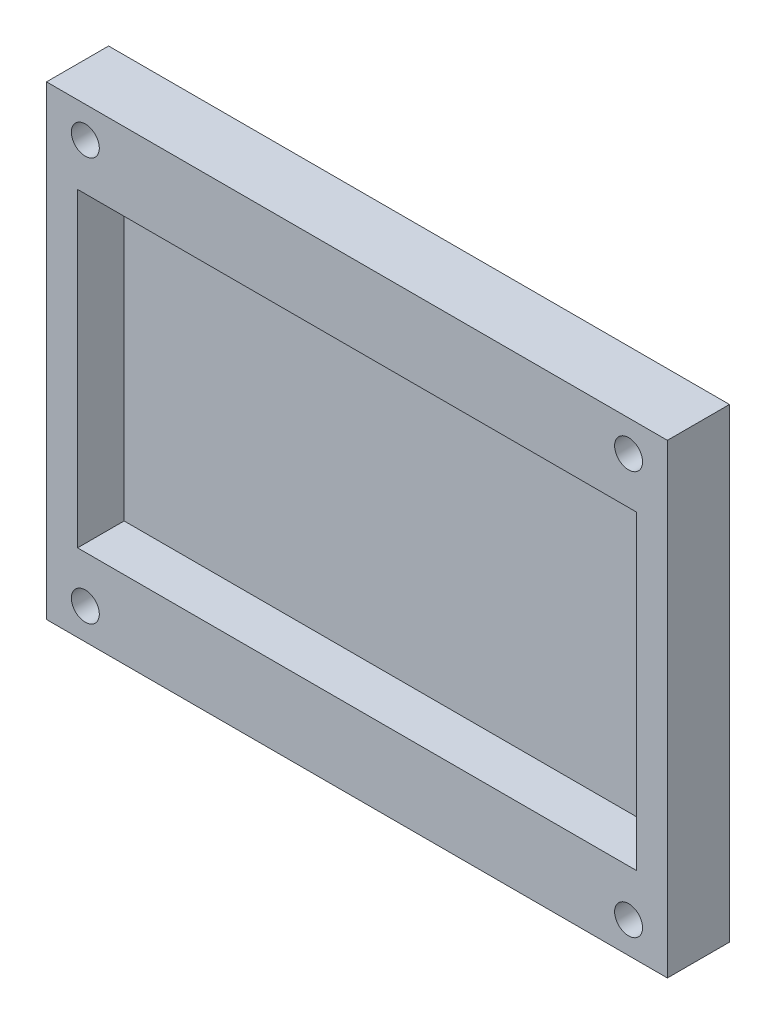
ISO-10303-21;
HEADER;
FILE_DESCRIPTION(('STEP AP214'),'2;1');
FILE_NAME('part.step','',(''),(''),'','','');
FILE_SCHEMA(('AUTOMOTIVE_DESIGN { 1 0 10303 214 1 1 1 1 }'));
ENDSEC;
DATA;
#1=APPLICATION_CONTEXT('core data for automotive mechanical design processes');
#2=APPLICATION_PROTOCOL_DEFINITION('international standard','automotive_design',2000,#1);
#3=PRODUCT_CONTEXT('',#1,'mechanical');
#4=PRODUCT('Part','Part','',(#3));
#5=PRODUCT_RELATED_PRODUCT_CATEGORY('part','',(#4));
#6=PRODUCT_DEFINITION_FORMATION('','',#4);
#7=PRODUCT_DEFINITION_CONTEXT('part definition',#1,'design');
#8=PRODUCT_DEFINITION('design','',#6,#7);
#9=PRODUCT_DEFINITION_SHAPE('','',#8);
#10=(LENGTH_UNIT() NAMED_UNIT(*) SI_UNIT(.MILLI.,.METRE.));
#11=(NAMED_UNIT(*) PLANE_ANGLE_UNIT() SI_UNIT($,.RADIAN.));
#12=(NAMED_UNIT(*) SI_UNIT($,.STERADIAN.) SOLID_ANGLE_UNIT());
#13=UNCERTAINTY_MEASURE_WITH_UNIT(LENGTH_MEASURE(1.E-05),#10,'distance_accuracy_value','');
#14=(GEOMETRIC_REPRESENTATION_CONTEXT(3) GLOBAL_UNCERTAINTY_ASSIGNED_CONTEXT((#13)) GLOBAL_UNIT_ASSIGNED_CONTEXT((#10,
#11,#12)) REPRESENTATION_CONTEXT('',''));
#15=CARTESIAN_POINT('',(0.,0.,0.));
#16=DIRECTION('',(0.,0.,1.));
#17=DIRECTION('',(1.,0.,0.));
#18=AXIS2_PLACEMENT_3D('',#15,#16,#17);
#19=CARTESIAN_POINT('',(20.,-15.,4.));
#20=DIRECTION('',(-1.,0.,0.));
#21=DIRECTION('',(0.,0.,1.));
#22=AXIS2_PLACEMENT_3D('',#19,#20,#21);
#23=PLANE('',#22);
#24=DIRECTION('',(0.,1.,0.));
#25=VECTOR('',#24,1.);
#26=CARTESIAN_POINT('',(20.,-15.,0.));
#27=LINE('',#26,#25);
#28=CARTESIAN_POINT('',(20.,-15.,0.));
#29=VERTEX_POINT('',#28);
#30=CARTESIAN_POINT('',(20.,15.,0.));
#31=VERTEX_POINT('',#30);
#32=EDGE_CURVE('E146',#29,#31,#27,.T.);
#33=ORIENTED_EDGE('',*,*,#32,.T.);
#34=DIRECTION('',(0.,0.,-1.));
#35=VECTOR('',#34,1.);
#36=CARTESIAN_POINT('',(20.,15.,4.));
#37=LINE('',#36,#35);
#38=CARTESIAN_POINT('',(20.,15.,4.));
#39=VERTEX_POINT('',#38);
#40=EDGE_CURVE('E11',#39,#31,#37,.T.);
#41=ORIENTED_EDGE('',*,*,#40,.F.);
#42=DIRECTION('',(0.,1.,0.));
#43=VECTOR('',#42,1.);
#44=CARTESIAN_POINT('',(20.,-15.,4.));
#45=LINE('',#44,#43);
#46=CARTESIAN_POINT('',(20.,-15.,4.));
#47=VERTEX_POINT('',#46);
#48=EDGE_CURVE('E150',#47,#39,#45,.T.);
#49=ORIENTED_EDGE('',*,*,#48,.F.);
#50=DIRECTION('',(0.,0.,-1.));
#51=VECTOR('',#50,1.);
#52=CARTESIAN_POINT('',(20.,-15.,4.));
#53=LINE('',#52,#51);
#54=EDGE_CURVE('E156',#47,#29,#53,.T.);
#55=ORIENTED_EDGE('',*,*,#54,.T.);
#56=EDGE_LOOP('',(#33,#41,#49,#55));
#57=FACE_BOUND('',#56,.T.);
#58=ADVANCED_FACE('F33',(#57),#23,.F.);
#59=CARTESIAN_POINT('',(-20.,15.,4.));
#60=DIRECTION('',(0.,-1.,0.));
#61=DIRECTION('',(0.,0.,-1.));
#62=AXIS2_PLACEMENT_3D('',#59,#60,#61);
#63=PLANE('',#62);
#64=DIRECTION('',(-1.,0.,0.));
#65=VECTOR('',#64,1.);
#66=CARTESIAN_POINT('',(-20.,15.,0.));
#67=LINE('',#66,#65);
#68=CARTESIAN_POINT('',(-20.,15.,0.));
#69=VERTEX_POINT('',#68);
#70=EDGE_CURVE('E159',#31,#69,#67,.T.);
#71=ORIENTED_EDGE('',*,*,#70,.T.);
#72=DIRECTION('',(0.,0.,-1.));
#73=VECTOR('',#72,1.);
#74=CARTESIAN_POINT('',(-20.,15.,4.));
#75=LINE('',#74,#73);
#76=CARTESIAN_POINT('',(-20.,15.,4.));
#77=VERTEX_POINT('',#76);
#78=EDGE_CURVE('E41',#77,#69,#75,.T.);
#79=ORIENTED_EDGE('',*,*,#78,.F.);
#80=DIRECTION('',(-1.,0.,0.));
#81=VECTOR('',#80,1.);
#82=CARTESIAN_POINT('',(-20.,15.,4.));
#83=LINE('',#82,#81);
#84=EDGE_CURVE('E86',#39,#77,#83,.T.);
#85=ORIENTED_EDGE('',*,*,#84,.F.);
#86=ORIENTED_EDGE('',*,*,#40,.T.);
#87=EDGE_LOOP('',(#71,#79,#85,#86));
#88=FACE_BOUND('',#87,.T.);
#89=ADVANCED_FACE('F220',(#88),#63,.F.);
#90=CARTESIAN_POINT('',(-20.,-15.,4.));
#91=DIRECTION('',(1.,0.,0.));
#92=DIRECTION('',(0.,0.,-1.));
#93=AXIS2_PLACEMENT_3D('',#90,#91,#92);
#94=PLANE('',#93);
#95=DIRECTION('',(0.,-1.,0.));
#96=VECTOR('',#95,1.);
#97=CARTESIAN_POINT('',(-20.,-15.,0.));
#98=LINE('',#97,#96);
#99=CARTESIAN_POINT('',(-20.,-15.,0.));
#100=VERTEX_POINT('',#99);
#101=EDGE_CURVE('E161',#69,#100,#98,.T.);
#102=ORIENTED_EDGE('',*,*,#101,.T.);
#103=DIRECTION('',(0.,0.,-1.));
#104=VECTOR('',#103,1.);
#105=CARTESIAN_POINT('',(-20.,-15.,4.));
#106=LINE('',#105,#104);
#107=CARTESIAN_POINT('',(-20.,-15.,4.));
#108=VERTEX_POINT('',#107);
#109=EDGE_CURVE('E165',#108,#100,#106,.T.);
#110=ORIENTED_EDGE('',*,*,#109,.F.);
#111=DIRECTION('',(0.,-1.,0.));
#112=VECTOR('',#111,1.);
#113=CARTESIAN_POINT('',(-20.,-15.,4.));
#114=LINE('',#113,#112);
#115=EDGE_CURVE('E153',#77,#108,#114,.T.);
#116=ORIENTED_EDGE('',*,*,#115,.F.);
#117=ORIENTED_EDGE('',*,*,#78,.T.);
#118=EDGE_LOOP('',(#102,#110,#116,#117));
#119=FACE_BOUND('',#118,.T.);
#120=ADVANCED_FACE('F225',(#119),#94,.F.);
#121=CARTESIAN_POINT('',(-20.,-15.,4.));
#122=DIRECTION('',(0.,1.,0.));
#123=DIRECTION('',(0.,0.,1.));
#124=AXIS2_PLACEMENT_3D('',#121,#122,#123);
#125=PLANE('',#124);
#126=DIRECTION('',(1.,0.,0.));
#127=VECTOR('',#126,1.);
#128=CARTESIAN_POINT('',(-20.,-15.,0.));
#129=LINE('',#128,#127);
#130=EDGE_CURVE('E79',#100,#29,#129,.T.);
#131=ORIENTED_EDGE('',*,*,#130,.T.);
#132=ORIENTED_EDGE('',*,*,#54,.F.);
#133=DIRECTION('',(1.,0.,0.));
#134=VECTOR('',#133,1.);
#135=CARTESIAN_POINT('',(-20.,-15.,4.));
#136=LINE('',#135,#134);
#137=EDGE_CURVE('E58',#108,#47,#136,.T.);
#138=ORIENTED_EDGE('',*,*,#137,.F.);
#139=ORIENTED_EDGE('',*,*,#109,.T.);
#140=EDGE_LOOP('',(#131,#132,#138,#139));
#141=FACE_BOUND('',#140,.T.);
#142=ADVANCED_FACE('F235',(#141),#125,.F.);
#143=CARTESIAN_POINT('',(0.,0.,4.));
#144=DIRECTION('',(0.,0.,-1.));
#145=DIRECTION('',(-1.,0.,0.));
#146=AXIS2_PLACEMENT_3D('',#143,#144,#145);
#147=PLANE('',#146);
#148=CARTESIAN_POINT('',(17.5,13.,4.));
#149=DIRECTION('',(0.,0.,-1.));
#150=DIRECTION('',(-1.,0.,0.));
#151=AXIS2_PLACEMENT_3D('',#148,#149,#150);
#152=CIRCLE('',#151,0.9);
#153=CARTESIAN_POINT('',(16.6,13.,4.));
#154=VERTEX_POINT('',#153);
#155=EDGE_CURVE('E190',#154,#154,#152,.T.);
#156=ORIENTED_EDGE('',*,*,#155,.T.);
#157=EDGE_LOOP('',(#156));
#158=FACE_BOUND('',#157,.T.);
#159=CARTESIAN_POINT('',(17.5,-13.,4.));
#160=DIRECTION('',(0.,0.,-1.));
#161=DIRECTION('',(-1.,0.,0.));
#162=AXIS2_PLACEMENT_3D('',#159,#160,#161);
#163=CIRCLE('',#162,0.9);
#164=CARTESIAN_POINT('',(16.6,-13.,4.));
#165=VERTEX_POINT('',#164);
#166=EDGE_CURVE('E192',#165,#165,#163,.T.);
#167=ORIENTED_EDGE('',*,*,#166,.T.);
#168=EDGE_LOOP('',(#167));
#169=FACE_BOUND('',#168,.T.);
#170=CARTESIAN_POINT('',(-17.5,-13.,4.));
#171=DIRECTION('',(0.,0.,-1.));
#172=DIRECTION('',(-1.,0.,0.));
#173=AXIS2_PLACEMENT_3D('',#170,#171,#172);
#174=CIRCLE('',#173,0.9);
#175=CARTESIAN_POINT('',(-18.4,-13.,4.));
#176=VERTEX_POINT('',#175);
#177=EDGE_CURVE('E194',#176,#176,#174,.T.);
#178=ORIENTED_EDGE('',*,*,#177,.T.);
#179=EDGE_LOOP('',(#178));
#180=FACE_BOUND('',#179,.T.);
#181=CARTESIAN_POINT('',(-17.5,13.,4.));
#182=DIRECTION('',(0.,0.,-1.));
#183=DIRECTION('',(-1.,0.,0.));
#184=AXIS2_PLACEMENT_3D('',#181,#182,#183);
#185=CIRCLE('',#184,0.9);
#186=CARTESIAN_POINT('',(-18.4,13.,4.));
#187=VERTEX_POINT('',#186);
#188=EDGE_CURVE('E134',#187,#187,#185,.T.);
#189=ORIENTED_EDGE('',*,*,#188,.T.);
#190=EDGE_LOOP('',(#189));
#191=FACE_BOUND('',#190,.T.);
#192=DIRECTION('',(0.,1.,0.));
#193=VECTOR('',#192,1.);
#194=CARTESIAN_POINT('',(18.,0.,4.));
#195=LINE('',#194,#193);
#196=CARTESIAN_POINT('',(18.,-10.,4.));
#197=VERTEX_POINT('',#196);
#198=CARTESIAN_POINT('',(18.,10.,4.));
#199=VERTEX_POINT('',#198);
#200=EDGE_CURVE('E140',#197,#199,#195,.T.);
#201=ORIENTED_EDGE('',*,*,#200,.F.);
#202=DIRECTION('',(1.,0.,0.));
#203=VECTOR('',#202,1.);
#204=CARTESIAN_POINT('',(0.,-10.,4.));
#205=LINE('',#204,#203);
#206=CARTESIAN_POINT('',(-18.,-10.,4.));
#207=VERTEX_POINT('',#206);
#208=EDGE_CURVE('E49',#207,#197,#205,.T.);
#209=ORIENTED_EDGE('',*,*,#208,.F.);
#210=DIRECTION('',(0.,-1.,0.));
#211=VECTOR('',#210,1.);
#212=CARTESIAN_POINT('',(-18.,0.,4.));
#213=LINE('',#212,#211);
#214=CARTESIAN_POINT('',(-18.,10.,4.));
#215=VERTEX_POINT('',#214);
#216=EDGE_CURVE('E128',#215,#207,#213,.T.);
#217=ORIENTED_EDGE('',*,*,#216,.F.);
#218=DIRECTION('',(-1.,0.,0.));
#219=VECTOR('',#218,1.);
#220=CARTESIAN_POINT('',(0.,10.,4.));
#221=LINE('',#220,#219);
#222=EDGE_CURVE('E131',#199,#215,#221,.T.);
#223=ORIENTED_EDGE('',*,*,#222,.F.);
#224=EDGE_LOOP('',(#201,#209,#217,#223));
#225=FACE_BOUND('',#224,.T.);
#226=ORIENTED_EDGE('',*,*,#48,.T.);
#227=ORIENTED_EDGE('',*,*,#84,.T.);
#228=ORIENTED_EDGE('',*,*,#115,.T.);
#229=ORIENTED_EDGE('',*,*,#137,.T.);
#230=EDGE_LOOP('',(#226,#227,#228,#229));
#231=FACE_BOUND('',#230,.T.);
#232=ADVANCED_FACE('F203',(#158,#169,#180,#191,#225,#231),#147,.F.);
#233=CARTESIAN_POINT('',(0.,0.,0.));
#234=DIRECTION('',(0.,0.,-1.));
#235=DIRECTION('',(-1.,0.,0.));
#236=AXIS2_PLACEMENT_3D('',#233,#234,#235);
#237=PLANE('',#236);
#238=CARTESIAN_POINT('',(17.5,13.,0.));
#239=DIRECTION('',(0.,0.,-1.));
#240=DIRECTION('',(-1.,0.,0.));
#241=AXIS2_PLACEMENT_3D('',#238,#239,#240);
#242=CIRCLE('',#241,0.9);
#243=CARTESIAN_POINT('',(16.6,13.,0.));
#244=VERTEX_POINT('',#243);
#245=EDGE_CURVE('E36',#244,#244,#242,.F.);
#246=ORIENTED_EDGE('',*,*,#245,.T.);
#247=EDGE_LOOP('',(#246));
#248=FACE_BOUND('',#247,.T.);
#249=CARTESIAN_POINT('',(17.5,-13.,0.));
#250=DIRECTION('',(0.,0.,-1.));
#251=DIRECTION('',(-1.,0.,0.));
#252=AXIS2_PLACEMENT_3D('',#249,#250,#251);
#253=CIRCLE('',#252,0.9);
#254=CARTESIAN_POINT('',(16.6,-13.,0.));
#255=VERTEX_POINT('',#254);
#256=EDGE_CURVE('E174',#255,#255,#253,.F.);
#257=ORIENTED_EDGE('',*,*,#256,.T.);
#258=EDGE_LOOP('',(#257));
#259=FACE_BOUND('',#258,.T.);
#260=CARTESIAN_POINT('',(-17.5,-13.,0.));
#261=DIRECTION('',(0.,0.,-1.));
#262=DIRECTION('',(-1.,0.,0.));
#263=AXIS2_PLACEMENT_3D('',#260,#261,#262);
#264=CIRCLE('',#263,0.9);
#265=CARTESIAN_POINT('',(-18.4,-13.,0.));
#266=VERTEX_POINT('',#265);
#267=EDGE_CURVE('E172',#266,#266,#264,.F.);
#268=ORIENTED_EDGE('',*,*,#267,.T.);
#269=EDGE_LOOP('',(#268));
#270=FACE_BOUND('',#269,.T.);
#271=CARTESIAN_POINT('',(-17.5,13.,0.));
#272=DIRECTION('',(0.,0.,-1.));
#273=DIRECTION('',(-1.,0.,0.));
#274=AXIS2_PLACEMENT_3D('',#271,#272,#273);
#275=CIRCLE('',#274,0.9);
#276=CARTESIAN_POINT('',(-18.4,13.,0.));
#277=VERTEX_POINT('',#276);
#278=EDGE_CURVE('E169',#277,#277,#275,.F.);
#279=ORIENTED_EDGE('',*,*,#278,.T.);
#280=EDGE_LOOP('',(#279));
#281=FACE_BOUND('',#280,.T.);
#282=ORIENTED_EDGE('',*,*,#32,.F.);
#283=ORIENTED_EDGE('',*,*,#130,.F.);
#284=ORIENTED_EDGE('',*,*,#101,.F.);
#285=ORIENTED_EDGE('',*,*,#70,.F.);
#286=EDGE_LOOP('',(#282,#283,#284,#285));
#287=FACE_BOUND('',#286,.T.);
#288=ADVANCED_FACE('F181',(#248,#259,#270,#281,#287),#237,.T.);
#289=CARTESIAN_POINT('',(0.,-10.,1.));
#290=DIRECTION('',(0.,-1.,0.));
#291=DIRECTION('',(0.,0.,-1.));
#292=AXIS2_PLACEMENT_3D('',#289,#290,#291);
#293=PLANE('',#292);
#294=ORIENTED_EDGE('',*,*,#208,.T.);
#295=DIRECTION('',(0.,0.,1.));
#296=VECTOR('',#295,1.);
#297=CARTESIAN_POINT('',(18.,-10.,1.));
#298=LINE('',#297,#296);
#299=CARTESIAN_POINT('',(18.,-10.,1.));
#300=VERTEX_POINT('',#299);
#301=EDGE_CURVE('E106',#300,#197,#298,.T.);
#302=ORIENTED_EDGE('',*,*,#301,.F.);
#303=DIRECTION('',(1.,0.,0.));
#304=VECTOR('',#303,1.);
#305=CARTESIAN_POINT('',(0.,-10.,1.));
#306=LINE('',#305,#304);
#307=CARTESIAN_POINT('',(-18.,-10.,1.));
#308=VERTEX_POINT('',#307);
#309=EDGE_CURVE('E110',#308,#300,#306,.T.);
#310=ORIENTED_EDGE('',*,*,#309,.F.);
#311=DIRECTION('',(0.,0.,1.));
#312=VECTOR('',#311,1.);
#313=CARTESIAN_POINT('',(-18.,-10.,1.));
#314=LINE('',#313,#312);
#315=EDGE_CURVE('E144',#308,#207,#314,.T.);
#316=ORIENTED_EDGE('',*,*,#315,.T.);
#317=EDGE_LOOP('',(#294,#302,#310,#316));
#318=FACE_BOUND('',#317,.T.);
#319=ADVANCED_FACE('F108',(#318),#293,.F.);
#320=CARTESIAN_POINT('',(-18.,0.,1.));
#321=DIRECTION('',(-1.,0.,0.));
#322=DIRECTION('',(0.,0.,1.));
#323=AXIS2_PLACEMENT_3D('',#320,#321,#322);
#324=PLANE('',#323);
#325=ORIENTED_EDGE('',*,*,#216,.T.);
#326=ORIENTED_EDGE('',*,*,#315,.F.);
#327=DIRECTION('',(0.,-1.,0.));
#328=VECTOR('',#327,1.);
#329=CARTESIAN_POINT('',(-18.,0.,1.));
#330=LINE('',#329,#328);
#331=CARTESIAN_POINT('',(-18.,10.,1.));
#332=VERTEX_POINT('',#331);
#333=EDGE_CURVE('E116',#332,#308,#330,.T.);
#334=ORIENTED_EDGE('',*,*,#333,.F.);
#335=DIRECTION('',(0.,0.,1.));
#336=VECTOR('',#335,1.);
#337=CARTESIAN_POINT('',(-18.,10.,1.));
#338=LINE('',#337,#336);
#339=EDGE_CURVE('E147',#332,#215,#338,.T.);
#340=ORIENTED_EDGE('',*,*,#339,.T.);
#341=EDGE_LOOP('',(#325,#326,#334,#340));
#342=FACE_BOUND('',#341,.T.);
#343=ADVANCED_FACE('F266',(#342),#324,.F.);
#344=CARTESIAN_POINT('',(0.,10.,1.));
#345=DIRECTION('',(0.,1.,0.));
#346=DIRECTION('',(0.,0.,1.));
#347=AXIS2_PLACEMENT_3D('',#344,#345,#346);
#348=PLANE('',#347);
#349=ORIENTED_EDGE('',*,*,#222,.T.);
#350=ORIENTED_EDGE('',*,*,#339,.F.);
#351=DIRECTION('',(-1.,0.,0.));
#352=VECTOR('',#351,1.);
#353=CARTESIAN_POINT('',(0.,10.,1.));
#354=LINE('',#353,#352);
#355=CARTESIAN_POINT('',(18.,10.,1.));
#356=VERTEX_POINT('',#355);
#357=EDGE_CURVE('E124',#356,#332,#354,.T.);
#358=ORIENTED_EDGE('',*,*,#357,.F.);
#359=DIRECTION('',(0.,0.,1.));
#360=VECTOR('',#359,1.);
#361=CARTESIAN_POINT('',(18.,10.,1.));
#362=LINE('',#361,#360);
#363=EDGE_CURVE('E115',#356,#199,#362,.T.);
#364=ORIENTED_EDGE('',*,*,#363,.T.);
#365=EDGE_LOOP('',(#349,#350,#358,#364));
#366=FACE_BOUND('',#365,.T.);
#367=ADVANCED_FACE('F275',(#366),#348,.F.);
#368=CARTESIAN_POINT('',(18.,0.,1.));
#369=DIRECTION('',(1.,0.,0.));
#370=DIRECTION('',(0.,0.,-1.));
#371=AXIS2_PLACEMENT_3D('',#368,#369,#370);
#372=PLANE('',#371);
#373=ORIENTED_EDGE('',*,*,#200,.T.);
#374=ORIENTED_EDGE('',*,*,#363,.F.);
#375=DIRECTION('',(0.,1.,0.));
#376=VECTOR('',#375,1.);
#377=CARTESIAN_POINT('',(18.,0.,1.));
#378=LINE('',#377,#376);
#379=EDGE_CURVE('E119',#300,#356,#378,.T.);
#380=ORIENTED_EDGE('',*,*,#379,.F.);
#381=ORIENTED_EDGE('',*,*,#301,.T.);
#382=EDGE_LOOP('',(#373,#374,#380,#381));
#383=FACE_BOUND('',#382,.T.);
#384=ADVANCED_FACE('F120',(#383),#372,.F.);
#385=CARTESIAN_POINT('',(0.,0.,1.));
#386=DIRECTION('',(0.,0.,1.));
#387=DIRECTION('',(1.,0.,0.));
#388=AXIS2_PLACEMENT_3D('',#385,#386,#387);
#389=PLANE('',#388);
#390=ORIENTED_EDGE('',*,*,#309,.T.);
#391=ORIENTED_EDGE('',*,*,#379,.T.);
#392=ORIENTED_EDGE('',*,*,#357,.T.);
#393=ORIENTED_EDGE('',*,*,#333,.T.);
#394=EDGE_LOOP('',(#390,#391,#392,#393));
#395=FACE_BOUND('',#394,.T.);
#396=ADVANCED_FACE('F126',(#395),#389,.T.);
#397=CARTESIAN_POINT('',(-17.5,13.,-9.));
#398=DIRECTION('',(0.,0.,1.));
#399=DIRECTION('',(1.,0.,0.));
#400=AXIS2_PLACEMENT_3D('',#397,#398,#399);
#401=CYLINDRICAL_SURFACE('',#400,0.9);
#402=ORIENTED_EDGE('',*,*,#278,.F.);
#403=EDGE_LOOP('',(#402));
#404=FACE_BOUND('',#403,.T.);
#405=ORIENTED_EDGE('',*,*,#188,.F.);
#406=EDGE_LOOP('',(#405));
#407=FACE_BOUND('',#406,.T.);
#408=ADVANCED_FACE('F206',(#404,#407),#401,.F.);
#409=CARTESIAN_POINT('',(-17.5,-13.,-9.));
#410=DIRECTION('',(0.,0.,1.));
#411=DIRECTION('',(1.,0.,0.));
#412=AXIS2_PLACEMENT_3D('',#409,#410,#411);
#413=CYLINDRICAL_SURFACE('',#412,0.9);
#414=ORIENTED_EDGE('',*,*,#267,.F.);
#415=EDGE_LOOP('',(#414));
#416=FACE_BOUND('',#415,.T.);
#417=ORIENTED_EDGE('',*,*,#177,.F.);
#418=EDGE_LOOP('',(#417));
#419=FACE_BOUND('',#418,.T.);
#420=ADVANCED_FACE('F208',(#416,#419),#413,.F.);
#421=CARTESIAN_POINT('',(17.5,-13.,-9.));
#422=DIRECTION('',(0.,0.,1.));
#423=DIRECTION('',(1.,0.,0.));
#424=AXIS2_PLACEMENT_3D('',#421,#422,#423);
#425=CYLINDRICAL_SURFACE('',#424,0.9);
#426=ORIENTED_EDGE('',*,*,#256,.F.);
#427=EDGE_LOOP('',(#426));
#428=FACE_BOUND('',#427,.T.);
#429=ORIENTED_EDGE('',*,*,#166,.F.);
#430=EDGE_LOOP('',(#429));
#431=FACE_BOUND('',#430,.T.);
#432=ADVANCED_FACE('F186',(#428,#431),#425,.F.);
#433=CARTESIAN_POINT('',(17.5,13.,-9.));
#434=DIRECTION('',(0.,0.,1.));
#435=DIRECTION('',(1.,0.,0.));
#436=AXIS2_PLACEMENT_3D('',#433,#434,#435);
#437=CYLINDRICAL_SURFACE('',#436,0.9);
#438=ORIENTED_EDGE('',*,*,#245,.F.);
#439=EDGE_LOOP('',(#438));
#440=FACE_BOUND('',#439,.T.);
#441=ORIENTED_EDGE('',*,*,#155,.F.);
#442=EDGE_LOOP('',(#441));
#443=FACE_BOUND('',#442,.T.);
#444=ADVANCED_FACE('F183',(#440,#443),#437,.F.);
#445=CLOSED_SHELL('',(#58,#89,#120,#142,#232,#288,#319,#343,#367,#384,#396,#408,#420,#432,#444));
#446=MANIFOLD_SOLID_BREP('B2',#445);
#447=ADVANCED_BREP_SHAPE_REPRESENTATION('',(#18,#446),#14);
#448=SHAPE_DEFINITION_REPRESENTATION(#9,#447);
ENDSEC;
END-ISO-10303-21;
